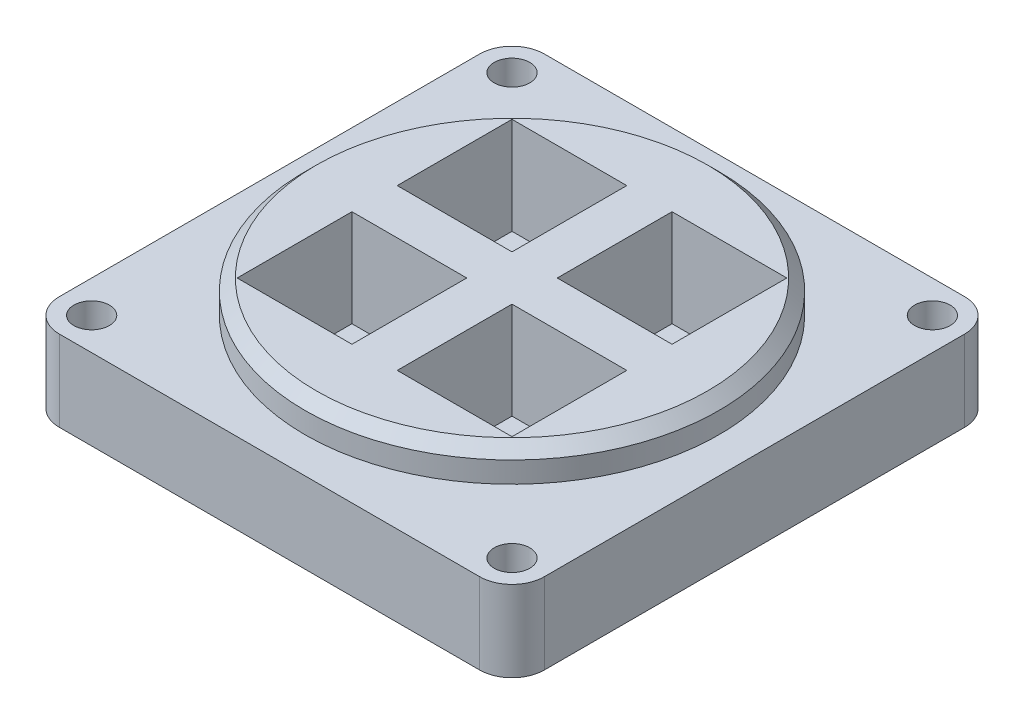
ISO-10303-21;
HEADER;
FILE_DESCRIPTION(('STEP AP214'),'2;1');
FILE_NAME('part.step','',(''),(''),'','','');
FILE_SCHEMA(('AUTOMOTIVE_DESIGN { 1 0 10303 214 1 1 1 1 }'));
ENDSEC;
DATA;
#1=APPLICATION_CONTEXT('core data for automotive mechanical design processes');
#2=APPLICATION_PROTOCOL_DEFINITION('international standard','automotive_design',2000,#1);
#3=PRODUCT_CONTEXT('',#1,'mechanical');
#4=PRODUCT('Part','Part','',(#3));
#5=PRODUCT_RELATED_PRODUCT_CATEGORY('part','',(#4));
#6=PRODUCT_DEFINITION_FORMATION('','',#4);
#7=PRODUCT_DEFINITION_CONTEXT('part definition',#1,'design');
#8=PRODUCT_DEFINITION('design','',#6,#7);
#9=PRODUCT_DEFINITION_SHAPE('','',#8);
#10=(LENGTH_UNIT() NAMED_UNIT(*) SI_UNIT(.MILLI.,.METRE.));
#11=(NAMED_UNIT(*) PLANE_ANGLE_UNIT() SI_UNIT($,.RADIAN.));
#12=(NAMED_UNIT(*) SI_UNIT($,.STERADIAN.) SOLID_ANGLE_UNIT());
#13=UNCERTAINTY_MEASURE_WITH_UNIT(LENGTH_MEASURE(1.E-05),#10,'distance_accuracy_value','');
#14=(GEOMETRIC_REPRESENTATION_CONTEXT(3) GLOBAL_UNCERTAINTY_ASSIGNED_CONTEXT((#13)) GLOBAL_UNIT_ASSIGNED_CONTEXT((#10,
#11,#12)) REPRESENTATION_CONTEXT('',''));
#15=CARTESIAN_POINT('',(0.,0.,0.));
#16=DIRECTION('',(0.,0.,1.));
#17=DIRECTION('',(1.,0.,0.));
#18=AXIS2_PLACEMENT_3D('',#15,#16,#17);
#19=CARTESIAN_POINT('',(0.,17.78,0.));
#20=DIRECTION('',(0.,1.,0.));
#21=DIRECTION('',(0.,0.,1.));
#22=AXIS2_PLACEMENT_3D('',#19,#20,#21);
#23=PLANE('',#22);
#24=CARTESIAN_POINT('',(0.,17.78,0.));
#25=DIRECTION('',(0.,1.,0.));
#26=DIRECTION('',(0.,0.,1.));
#27=AXIS2_PLACEMENT_3D('',#24,#25,#26);
#28=CIRCLE('',#27,30.734);
#29=CARTESIAN_POINT('',(0.,17.78,30.734));
#30=VERTEX_POINT('',#29);
#31=EDGE_CURVE('E50',#30,#30,#28,.T.);
#32=ORIENTED_EDGE('',*,*,#31,.T.);
#33=EDGE_LOOP('',(#32));
#34=FACE_BOUND('',#33,.T.);
#35=DIRECTION('',(-1.,0.,0.));
#36=VECTOR('',#35,1.);
#37=CARTESIAN_POINT('',(-3.5553585694968,17.78,21.5893585694968));
#38=LINE('',#37,#36);
#39=CARTESIAN_POINT('',(-3.5553585694968,17.78,21.5893585694968));
#40=VERTEX_POINT('',#39);
#41=CARTESIAN_POINT('',(-21.5893585694968,17.78,21.5893585694968));
#42=VERTEX_POINT('',#41);
#43=EDGE_CURVE('E311',#40,#42,#38,.T.);
#44=ORIENTED_EDGE('',*,*,#43,.T.);
#45=DIRECTION('',(0.,0.,-1.));
#46=VECTOR('',#45,1.);
#47=CARTESIAN_POINT('',(-21.5893585694968,17.78,21.5893585694968));
#48=LINE('',#47,#46);
#49=CARTESIAN_POINT('',(-21.5893585694968,17.78,3.55535856949682));
#50=VERTEX_POINT('',#49);
#51=EDGE_CURVE('E236',#42,#50,#48,.T.);
#52=ORIENTED_EDGE('',*,*,#51,.T.);
#53=DIRECTION('',(1.,0.,0.));
#54=VECTOR('',#53,1.);
#55=CARTESIAN_POINT('',(-21.5893585694968,17.78,3.55535856949682));
#56=LINE('',#55,#54);
#57=CARTESIAN_POINT('',(-3.5553585694968,17.78,3.55535856949682));
#58=VERTEX_POINT('',#57);
#59=EDGE_CURVE('E320',#50,#58,#56,.T.);
#60=ORIENTED_EDGE('',*,*,#59,.T.);
#61=DIRECTION('',(0.,0.,1.));
#62=VECTOR('',#61,1.);
#63=CARTESIAN_POINT('',(-3.5553585694968,17.78,3.55535856949682));
#64=LINE('',#63,#62);
#65=EDGE_CURVE('E323',#58,#40,#64,.T.);
#66=ORIENTED_EDGE('',*,*,#65,.T.);
#67=EDGE_LOOP('',(#44,#52,#60,#66));
#68=FACE_BOUND('',#67,.T.);
#69=DIRECTION('',(-1.,0.,0.));
#70=VECTOR('',#69,1.);
#71=CARTESIAN_POINT('',(-3.55535856949682,17.78,-3.5553585694968));
#72=LINE('',#71,#70);
#73=CARTESIAN_POINT('',(-3.55535856949682,17.78,-3.5553585694968));
#74=VERTEX_POINT('',#73);
#75=CARTESIAN_POINT('',(-21.5893585694968,17.78,-3.5553585694968));
#76=VERTEX_POINT('',#75);
#77=EDGE_CURVE('E221',#74,#76,#72,.T.);
#78=ORIENTED_EDGE('',*,*,#77,.T.);
#79=DIRECTION('',(0.,0.,-1.));
#80=VECTOR('',#79,1.);
#81=CARTESIAN_POINT('',(-21.5893585694968,17.78,-3.5553585694968));
#82=LINE('',#81,#80);
#83=CARTESIAN_POINT('',(-21.5893585694968,17.78,-21.5893585694968));
#84=VERTEX_POINT('',#83);
#85=EDGE_CURVE('E231',#76,#84,#82,.T.);
#86=ORIENTED_EDGE('',*,*,#85,.T.);
#87=DIRECTION('',(1.,0.,0.));
#88=VECTOR('',#87,1.);
#89=CARTESIAN_POINT('',(-21.5893585694968,17.78,-21.5893585694968));
#90=LINE('',#89,#88);
#91=CARTESIAN_POINT('',(-3.55535856949682,17.78,-21.5893585694968));
#92=VERTEX_POINT('',#91);
#93=EDGE_CURVE('E229',#84,#92,#90,.T.);
#94=ORIENTED_EDGE('',*,*,#93,.T.);
#95=DIRECTION('',(0.,0.,1.));
#96=VECTOR('',#95,1.);
#97=CARTESIAN_POINT('',(-3.55535856949682,17.78,-21.5893585694968));
#98=LINE('',#97,#96);
#99=EDGE_CURVE('E210',#92,#74,#98,.T.);
#100=ORIENTED_EDGE('',*,*,#99,.T.);
#101=EDGE_LOOP('',(#78,#86,#94,#100));
#102=FACE_BOUND('',#101,.T.);
#103=DIRECTION('',(1.,0.,0.));
#104=VECTOR('',#103,1.);
#105=CARTESIAN_POINT('',(3.5553585694968,17.78,-21.5893585694968));
#106=LINE('',#105,#104);
#107=CARTESIAN_POINT('',(3.5553585694968,17.78,-21.5893585694968));
#108=VERTEX_POINT('',#107);
#109=CARTESIAN_POINT('',(21.5893585694968,17.78,-21.5893585694968));
#110=VERTEX_POINT('',#109);
#111=EDGE_CURVE('E256',#108,#110,#106,.T.);
#112=ORIENTED_EDGE('',*,*,#111,.T.);
#113=DIRECTION('',(0.,0.,1.));
#114=VECTOR('',#113,1.);
#115=CARTESIAN_POINT('',(21.5893585694968,17.78,-21.5893585694968));
#116=LINE('',#115,#114);
#117=CARTESIAN_POINT('',(21.5893585694968,17.78,-3.55535856949682));
#118=VERTEX_POINT('',#117);
#119=EDGE_CURVE('E266',#110,#118,#116,.T.);
#120=ORIENTED_EDGE('',*,*,#119,.T.);
#121=DIRECTION('',(-1.,0.,0.));
#122=VECTOR('',#121,1.);
#123=CARTESIAN_POINT('',(21.5893585694968,17.78,-3.55535856949682));
#124=LINE('',#123,#122);
#125=CARTESIAN_POINT('',(3.5553585694968,17.78,-3.55535856949682));
#126=VERTEX_POINT('',#125);
#127=EDGE_CURVE('E263',#118,#126,#124,.T.);
#128=ORIENTED_EDGE('',*,*,#127,.T.);
#129=DIRECTION('',(0.,0.,-1.));
#130=VECTOR('',#129,1.);
#131=CARTESIAN_POINT('',(3.5553585694968,17.78,-3.55535856949682));
#132=LINE('',#131,#130);
#133=EDGE_CURVE('E259',#126,#108,#132,.T.);
#134=ORIENTED_EDGE('',*,*,#133,.T.);
#135=EDGE_LOOP('',(#112,#120,#128,#134));
#136=FACE_BOUND('',#135,.T.);
#137=DIRECTION('',(0.,0.,1.));
#138=VECTOR('',#137,1.);
#139=CARTESIAN_POINT('',(21.5893585694968,17.78,3.5553585694968));
#140=LINE('',#139,#138);
#141=CARTESIAN_POINT('',(21.5893585694968,17.78,3.5553585694968));
#142=VERTEX_POINT('',#141);
#143=CARTESIAN_POINT('',(21.5893585694968,17.78,21.5893585694968));
#144=VERTEX_POINT('',#143);
#145=EDGE_CURVE('E288',#142,#144,#140,.T.);
#146=ORIENTED_EDGE('',*,*,#145,.T.);
#147=DIRECTION('',(-1.,0.,0.));
#148=VECTOR('',#147,1.);
#149=CARTESIAN_POINT('',(21.5893585694968,17.78,21.5893585694968));
#150=LINE('',#149,#148);
#151=CARTESIAN_POINT('',(3.55535856949682,17.78,21.5893585694968));
#152=VERTEX_POINT('',#151);
#153=EDGE_CURVE('E248',#144,#152,#150,.T.);
#154=ORIENTED_EDGE('',*,*,#153,.T.);
#155=DIRECTION('',(0.,0.,-1.));
#156=VECTOR('',#155,1.);
#157=CARTESIAN_POINT('',(3.55535856949682,17.78,21.5893585694968));
#158=LINE('',#157,#156);
#159=CARTESIAN_POINT('',(3.55535856949682,17.78,3.5553585694968));
#160=VERTEX_POINT('',#159);
#161=EDGE_CURVE('E295',#152,#160,#158,.T.);
#162=ORIENTED_EDGE('',*,*,#161,.T.);
#163=DIRECTION('',(1.,0.,0.));
#164=VECTOR('',#163,1.);
#165=CARTESIAN_POINT('',(3.55535856949682,17.78,3.5553585694968));
#166=LINE('',#165,#164);
#167=EDGE_CURVE('E291',#160,#142,#166,.T.);
#168=ORIENTED_EDGE('',*,*,#167,.T.);
#169=EDGE_LOOP('',(#146,#154,#162,#168));
#170=FACE_BOUND('',#169,.T.);
#171=ADVANCED_FACE('F41',(#34,#68,#102,#136,#170),#23,.T.);
#172=CARTESIAN_POINT('',(38.1,12.7,38.1));
#173=DIRECTION('',(-1.,0.,0.));
#174=DIRECTION('',(0.,0.,1.));
#175=AXIS2_PLACEMENT_3D('',#172,#173,#174);
#176=PLANE('',#175);
#177=DIRECTION('',(0.,0.,-1.));
#178=VECTOR('',#177,1.);
#179=CARTESIAN_POINT('',(38.1,12.7,38.1));
#180=LINE('',#179,#178);
#181=CARTESIAN_POINT('',(38.1,12.7,33.02));
#182=VERTEX_POINT('',#181);
#183=CARTESIAN_POINT('',(38.1,12.7,-33.02));
#184=VERTEX_POINT('',#183);
#185=EDGE_CURVE('E362',#182,#184,#180,.T.);
#186=ORIENTED_EDGE('',*,*,#185,.F.);
#187=DIRECTION('',(0.,-1.,0.));
#188=VECTOR('',#187,1.);
#189=CARTESIAN_POINT('',(38.1,12.7,33.02));
#190=LINE('',#189,#188);
#191=CARTESIAN_POINT('',(38.1,0.,33.02));
#192=VERTEX_POINT('',#191);
#193=EDGE_CURVE('E412',#182,#192,#190,.T.);
#194=ORIENTED_EDGE('',*,*,#193,.T.);
#195=DIRECTION('',(0.,0.,-1.));
#196=VECTOR('',#195,1.);
#197=CARTESIAN_POINT('',(38.1,0.,38.1));
#198=LINE('',#197,#196);
#199=CARTESIAN_POINT('',(38.1,0.,-33.02));
#200=VERTEX_POINT('',#199);
#201=EDGE_CURVE('E359',#192,#200,#198,.T.);
#202=ORIENTED_EDGE('',*,*,#201,.T.);
#203=DIRECTION('',(0.,-1.,0.));
#204=VECTOR('',#203,1.);
#205=CARTESIAN_POINT('',(38.1,12.7,-33.02));
#206=LINE('',#205,#204);
#207=EDGE_CURVE('E410',#200,#184,#206,.F.);
#208=ORIENTED_EDGE('',*,*,#207,.T.);
#209=EDGE_LOOP('',(#186,#194,#202,#208));
#210=FACE_BOUND('',#209,.T.);
#211=ADVANCED_FACE('F433',(#210),#176,.F.);
#212=CARTESIAN_POINT('',(-38.1,12.7,-38.1));
#213=DIRECTION('',(0.,0.,1.));
#214=DIRECTION('',(1.,0.,0.));
#215=AXIS2_PLACEMENT_3D('',#212,#213,#214);
#216=PLANE('',#215);
#217=DIRECTION('',(-1.,0.,0.));
#218=VECTOR('',#217,1.);
#219=CARTESIAN_POINT('',(-38.1,12.7,-38.1));
#220=LINE('',#219,#218);
#221=CARTESIAN_POINT('',(33.02,12.7,-38.1));
#222=VERTEX_POINT('',#221);
#223=CARTESIAN_POINT('',(-33.02,12.7,-38.1));
#224=VERTEX_POINT('',#223);
#225=EDGE_CURVE('E364',#222,#224,#220,.T.);
#226=ORIENTED_EDGE('',*,*,#225,.F.);
#227=DIRECTION('',(0.,-1.,0.));
#228=VECTOR('',#227,1.);
#229=CARTESIAN_POINT('',(33.02,12.7,-38.1));
#230=LINE('',#229,#228);
#231=CARTESIAN_POINT('',(33.02,0.,-38.1));
#232=VERTEX_POINT('',#231);
#233=EDGE_CURVE('E416',#222,#232,#230,.T.);
#234=ORIENTED_EDGE('',*,*,#233,.T.);
#235=DIRECTION('',(-1.,0.,0.));
#236=VECTOR('',#235,1.);
#237=CARTESIAN_POINT('',(-38.1,0.,-38.1));
#238=LINE('',#237,#236);
#239=CARTESIAN_POINT('',(-33.02,0.,-38.1));
#240=VERTEX_POINT('',#239);
#241=EDGE_CURVE('E376',#232,#240,#238,.T.);
#242=ORIENTED_EDGE('',*,*,#241,.T.);
#243=DIRECTION('',(0.,-1.,0.));
#244=VECTOR('',#243,1.);
#245=CARTESIAN_POINT('',(-33.02,12.7,-38.1));
#246=LINE('',#245,#244);
#247=EDGE_CURVE('E57',#240,#224,#246,.F.);
#248=ORIENTED_EDGE('',*,*,#247,.T.);
#249=EDGE_LOOP('',(#226,#234,#242,#248));
#250=FACE_BOUND('',#249,.T.);
#251=ADVANCED_FACE('F438',(#250),#216,.F.);
#252=CARTESIAN_POINT('',(-38.1,12.7,38.1));
#253=DIRECTION('',(1.,0.,0.));
#254=DIRECTION('',(0.,0.,-1.));
#255=AXIS2_PLACEMENT_3D('',#252,#253,#254);
#256=PLANE('',#255);
#257=DIRECTION('',(0.,0.,1.));
#258=VECTOR('',#257,1.);
#259=CARTESIAN_POINT('',(-38.1,0.,38.1));
#260=LINE('',#259,#258);
#261=CARTESIAN_POINT('',(-38.1,0.,-33.02));
#262=VERTEX_POINT('',#261);
#263=CARTESIAN_POINT('',(-38.1,0.,33.02));
#264=VERTEX_POINT('',#263);
#265=EDGE_CURVE('E378',#262,#264,#260,.T.);
#266=ORIENTED_EDGE('',*,*,#265,.T.);
#267=DIRECTION('',(0.,-1.,0.));
#268=VECTOR('',#267,1.);
#269=CARTESIAN_POINT('',(-38.1,12.7,33.02));
#270=LINE('',#269,#268);
#271=CARTESIAN_POINT('',(-38.1,12.7,33.02));
#272=VERTEX_POINT('',#271);
#273=EDGE_CURVE('E401',#264,#272,#270,.F.);
#274=ORIENTED_EDGE('',*,*,#273,.T.);
#275=DIRECTION('',(0.,0.,1.));
#276=VECTOR('',#275,1.);
#277=CARTESIAN_POINT('',(-38.1,12.7,38.1));
#278=LINE('',#277,#276);
#279=CARTESIAN_POINT('',(-38.1,12.7,-33.02));
#280=VERTEX_POINT('',#279);
#281=EDGE_CURVE('E367',#280,#272,#278,.T.);
#282=ORIENTED_EDGE('',*,*,#281,.F.);
#283=DIRECTION('',(0.,-1.,0.));
#284=VECTOR('',#283,1.);
#285=CARTESIAN_POINT('',(-38.1,12.7,-33.02));
#286=LINE('',#285,#284);
#287=EDGE_CURVE('E398',#280,#262,#286,.T.);
#288=ORIENTED_EDGE('',*,*,#287,.T.);
#289=EDGE_LOOP('',(#266,#274,#282,#288));
#290=FACE_BOUND('',#289,.T.);
#291=ADVANCED_FACE('F476',(#290),#256,.F.);
#292=CARTESIAN_POINT('',(-38.1,12.7,38.1));
#293=DIRECTION('',(0.,0.,-1.));
#294=DIRECTION('',(-1.,0.,0.));
#295=AXIS2_PLACEMENT_3D('',#292,#293,#294);
#296=PLANE('',#295);
#297=DIRECTION('',(1.,0.,0.));
#298=VECTOR('',#297,1.);
#299=CARTESIAN_POINT('',(-38.1,12.7,38.1));
#300=LINE('',#299,#298);
#301=CARTESIAN_POINT('',(-33.02,12.7,38.1));
#302=VERTEX_POINT('',#301);
#303=CARTESIAN_POINT('',(33.02,12.7,38.1));
#304=VERTEX_POINT('',#303);
#305=EDGE_CURVE('E370',#302,#304,#300,.T.);
#306=ORIENTED_EDGE('',*,*,#305,.F.);
#307=DIRECTION('',(0.,-1.,0.));
#308=VECTOR('',#307,1.);
#309=CARTESIAN_POINT('',(-33.02,12.7,38.1));
#310=LINE('',#309,#308);
#311=CARTESIAN_POINT('',(-33.02,0.,38.1));
#312=VERTEX_POINT('',#311);
#313=EDGE_CURVE('E387',#302,#312,#310,.T.);
#314=ORIENTED_EDGE('',*,*,#313,.T.);
#315=DIRECTION('',(1.,0.,0.));
#316=VECTOR('',#315,1.);
#317=CARTESIAN_POINT('',(-38.1,0.,38.1));
#318=LINE('',#317,#316);
#319=CARTESIAN_POINT('',(33.02,0.,38.1));
#320=VERTEX_POINT('',#319);
#321=EDGE_CURVE('E365',#312,#320,#318,.T.);
#322=ORIENTED_EDGE('',*,*,#321,.T.);
#323=DIRECTION('',(0.,-1.,0.));
#324=VECTOR('',#323,1.);
#325=CARTESIAN_POINT('',(33.02,12.7,38.1));
#326=LINE('',#325,#324);
#327=EDGE_CURVE('E385',#320,#304,#326,.F.);
#328=ORIENTED_EDGE('',*,*,#327,.T.);
#329=EDGE_LOOP('',(#306,#314,#322,#328));
#330=FACE_BOUND('',#329,.T.);
#331=ADVANCED_FACE('F469',(#330),#296,.F.);
#332=CARTESIAN_POINT('',(0.,12.7,0.));
#333=DIRECTION('',(0.,-1.,0.));
#334=DIRECTION('',(0.,0.,-1.));
#335=AXIS2_PLACEMENT_3D('',#332,#333,#334);
#336=PLANE('',#335);
#337=CARTESIAN_POINT('',(0.,12.7,0.));
#338=DIRECTION('',(0.,-1.,0.));
#339=DIRECTION('',(0.,0.,-1.));
#340=AXIS2_PLACEMENT_3D('',#337,#338,#339);
#341=CIRCLE('',#340,32.512);
#342=CARTESIAN_POINT('',(0.,12.7,-32.512));
#343=VERTEX_POINT('',#342);
#344=EDGE_CURVE('E373',#343,#343,#341,.F.);
#345=ORIENTED_EDGE('',*,*,#344,.F.);
#346=EDGE_LOOP('',(#345));
#347=FACE_BOUND('',#346,.T.);
#348=CARTESIAN_POINT('',(33.02,12.7,-33.02));
#349=DIRECTION('',(0.,1.,0.));
#350=DIRECTION('',(0.,0.,1.));
#351=AXIS2_PLACEMENT_3D('',#348,#349,#350);
#352=CIRCLE('',#351,2.794);
#353=CARTESIAN_POINT('',(33.02,12.7,-30.226));
#354=VERTEX_POINT('',#353);
#355=EDGE_CURVE('E344',#354,#354,#352,.T.);
#356=ORIENTED_EDGE('',*,*,#355,.F.);
#357=EDGE_LOOP('',(#356));
#358=FACE_BOUND('',#357,.T.);
#359=CARTESIAN_POINT('',(-33.02,12.7,33.02));
#360=DIRECTION('',(0.,1.,0.));
#361=DIRECTION('',(0.,0.,1.));
#362=AXIS2_PLACEMENT_3D('',#359,#360,#361);
#363=CIRCLE('',#362,2.794);
#364=CARTESIAN_POINT('',(-33.02,12.7,35.814));
#365=VERTEX_POINT('',#364);
#366=EDGE_CURVE('E351',#365,#365,#363,.T.);
#367=ORIENTED_EDGE('',*,*,#366,.F.);
#368=EDGE_LOOP('',(#367));
#369=FACE_BOUND('',#368,.T.);
#370=CARTESIAN_POINT('',(-33.02,12.7,-33.02));
#371=DIRECTION('',(0.,1.,0.));
#372=DIRECTION('',(0.,0.,1.));
#373=AXIS2_PLACEMENT_3D('',#370,#371,#372);
#374=CIRCLE('',#373,2.794);
#375=CARTESIAN_POINT('',(-33.02,12.7,-30.226));
#376=VERTEX_POINT('',#375);
#377=EDGE_CURVE('E338',#376,#376,#374,.T.);
#378=ORIENTED_EDGE('',*,*,#377,.F.);
#379=EDGE_LOOP('',(#378));
#380=FACE_BOUND('',#379,.T.);
#381=CARTESIAN_POINT('',(33.02,12.7,33.02));
#382=DIRECTION('',(0.,1.,0.));
#383=DIRECTION('',(0.,0.,1.));
#384=AXIS2_PLACEMENT_3D('',#381,#382,#383);
#385=CIRCLE('',#384,2.794);
#386=CARTESIAN_POINT('',(33.02,12.7,35.814));
#387=VERTEX_POINT('',#386);
#388=EDGE_CURVE('E347',#387,#387,#385,.T.);
#389=ORIENTED_EDGE('',*,*,#388,.F.);
#390=EDGE_LOOP('',(#389));
#391=FACE_BOUND('',#390,.T.);
#392=ORIENTED_EDGE('',*,*,#281,.T.);
#393=CARTESIAN_POINT('',(-33.02,12.7,33.02));
#394=DIRECTION('',(0.,-1.,0.));
#395=DIRECTION('',(0.,0.,-1.));
#396=AXIS2_PLACEMENT_3D('',#393,#394,#395);
#397=CIRCLE('',#396,5.08);
#398=EDGE_CURVE('E408',#272,#302,#397,.F.);
#399=ORIENTED_EDGE('',*,*,#398,.T.);
#400=ORIENTED_EDGE('',*,*,#305,.T.);
#401=CARTESIAN_POINT('',(33.02,12.7,33.02));
#402=DIRECTION('',(0.,-1.,0.));
#403=DIRECTION('',(0.,0.,-1.));
#404=AXIS2_PLACEMENT_3D('',#401,#402,#403);
#405=CIRCLE('',#404,5.08);
#406=EDGE_CURVE('E406',#304,#182,#405,.F.);
#407=ORIENTED_EDGE('',*,*,#406,.T.);
#408=ORIENTED_EDGE('',*,*,#185,.T.);
#409=CARTESIAN_POINT('',(33.02,12.7,-33.02));
#410=DIRECTION('',(0.,-1.,0.));
#411=DIRECTION('',(0.,0.,-1.));
#412=AXIS2_PLACEMENT_3D('',#409,#410,#411);
#413=CIRCLE('',#412,5.08);
#414=EDGE_CURVE('E64',#184,#222,#413,.F.);
#415=ORIENTED_EDGE('',*,*,#414,.T.);
#416=ORIENTED_EDGE('',*,*,#225,.T.);
#417=CARTESIAN_POINT('',(-33.02,12.7,-33.02));
#418=DIRECTION('',(0.,-1.,0.));
#419=DIRECTION('',(0.,0.,-1.));
#420=AXIS2_PLACEMENT_3D('',#417,#418,#419);
#421=CIRCLE('',#420,5.08);
#422=EDGE_CURVE('E403',#224,#280,#421,.F.);
#423=ORIENTED_EDGE('',*,*,#422,.T.);
#424=EDGE_LOOP('',(#392,#399,#400,#407,#408,#415,#416,#423));
#425=FACE_BOUND('',#424,.T.);
#426=ADVANCED_FACE('F466',(#347,#358,#369,#380,#391,#425),#336,.F.);
#427=CARTESIAN_POINT('',(0.,0.,0.));
#428=DIRECTION('',(0.,-1.,0.));
#429=DIRECTION('',(0.,0.,-1.));
#430=AXIS2_PLACEMENT_3D('',#427,#428,#429);
#431=PLANE('',#430);
#432=CARTESIAN_POINT('',(33.02,0.,-33.02));
#433=DIRECTION('',(0.,1.,0.));
#434=DIRECTION('',(0.,0.,1.));
#435=AXIS2_PLACEMENT_3D('',#432,#433,#434);
#436=CIRCLE('',#435,2.794);
#437=CARTESIAN_POINT('',(33.02,0.,-30.226));
#438=VERTEX_POINT('',#437);
#439=EDGE_CURVE('E348',#438,#438,#436,.T.);
#440=ORIENTED_EDGE('',*,*,#439,.T.);
#441=EDGE_LOOP('',(#440));
#442=FACE_BOUND('',#441,.T.);
#443=CARTESIAN_POINT('',(-33.02,0.,33.02));
#444=DIRECTION('',(0.,1.,0.));
#445=DIRECTION('',(0.,0.,1.));
#446=AXIS2_PLACEMENT_3D('',#443,#444,#445);
#447=CIRCLE('',#446,2.794);
#448=CARTESIAN_POINT('',(-33.02,0.,35.814));
#449=VERTEX_POINT('',#448);
#450=EDGE_CURVE('E341',#449,#449,#447,.T.);
#451=ORIENTED_EDGE('',*,*,#450,.T.);
#452=EDGE_LOOP('',(#451));
#453=FACE_BOUND('',#452,.T.);
#454=CARTESIAN_POINT('',(-33.02,0.,-33.02));
#455=DIRECTION('',(0.,1.,0.));
#456=DIRECTION('',(0.,0.,1.));
#457=AXIS2_PLACEMENT_3D('',#454,#455,#456);
#458=CIRCLE('',#457,2.794);
#459=CARTESIAN_POINT('',(-33.02,0.,-30.226));
#460=VERTEX_POINT('',#459);
#461=EDGE_CURVE('E337',#460,#460,#458,.T.);
#462=ORIENTED_EDGE('',*,*,#461,.T.);
#463=EDGE_LOOP('',(#462));
#464=FACE_BOUND('',#463,.T.);
#465=CARTESIAN_POINT('',(33.02,0.,33.02));
#466=DIRECTION('',(0.,1.,0.));
#467=DIRECTION('',(0.,0.,1.));
#468=AXIS2_PLACEMENT_3D('',#465,#466,#467);
#469=CIRCLE('',#468,2.794);
#470=CARTESIAN_POINT('',(33.02,0.,35.814));
#471=VERTEX_POINT('',#470);
#472=EDGE_CURVE('E356',#471,#471,#469,.T.);
#473=ORIENTED_EDGE('',*,*,#472,.T.);
#474=EDGE_LOOP('',(#473));
#475=FACE_BOUND('',#474,.T.);
#476=ORIENTED_EDGE('',*,*,#321,.F.);
#477=CARTESIAN_POINT('',(-33.02,0.,33.02));
#478=DIRECTION('',(0.,-1.,0.));
#479=DIRECTION('',(0.,0.,-1.));
#480=AXIS2_PLACEMENT_3D('',#477,#478,#479);
#481=CIRCLE('',#480,5.08);
#482=EDGE_CURVE('E396',#312,#264,#481,.T.);
#483=ORIENTED_EDGE('',*,*,#482,.T.);
#484=ORIENTED_EDGE('',*,*,#265,.F.);
#485=CARTESIAN_POINT('',(-33.02,0.,-33.02));
#486=DIRECTION('',(0.,-1.,0.));
#487=DIRECTION('',(0.,0.,-1.));
#488=AXIS2_PLACEMENT_3D('',#485,#486,#487);
#489=CIRCLE('',#488,5.08);
#490=EDGE_CURVE('E390',#262,#240,#489,.T.);
#491=ORIENTED_EDGE('',*,*,#490,.T.);
#492=ORIENTED_EDGE('',*,*,#241,.F.);
#493=CARTESIAN_POINT('',(33.02,0.,-33.02));
#494=DIRECTION('',(0.,-1.,0.));
#495=DIRECTION('',(0.,0.,-1.));
#496=AXIS2_PLACEMENT_3D('',#493,#494,#495);
#497=CIRCLE('',#496,5.08);
#498=EDGE_CURVE('E392',#232,#200,#497,.T.);
#499=ORIENTED_EDGE('',*,*,#498,.T.);
#500=ORIENTED_EDGE('',*,*,#201,.F.);
#501=CARTESIAN_POINT('',(33.02,0.,33.02));
#502=DIRECTION('',(0.,-1.,0.));
#503=DIRECTION('',(0.,0.,-1.));
#504=AXIS2_PLACEMENT_3D('',#501,#502,#503);
#505=CIRCLE('',#504,5.08);
#506=EDGE_CURVE('E394',#192,#320,#505,.T.);
#507=ORIENTED_EDGE('',*,*,#506,.T.);
#508=EDGE_LOOP('',(#476,#483,#484,#491,#492,#499,#500,#507));
#509=FACE_BOUND('',#508,.T.);
#510=ADVANCED_FACE('F464',(#442,#453,#464,#475,#509),#431,.T.);
#511=CARTESIAN_POINT('',(33.02,0.,33.02));
#512=DIRECTION('',(0.,1.,0.));
#513=DIRECTION('',(0.,0.,1.));
#514=AXIS2_PLACEMENT_3D('',#511,#512,#513);
#515=CYLINDRICAL_SURFACE('',#514,2.794);
#516=ORIENTED_EDGE('',*,*,#472,.F.);
#517=EDGE_LOOP('',(#516));
#518=FACE_BOUND('',#517,.T.);
#519=ORIENTED_EDGE('',*,*,#388,.T.);
#520=EDGE_LOOP('',(#519));
#521=FACE_BOUND('',#520,.T.);
#522=ADVANCED_FACE('F454',(#518,#521),#515,.F.);
#523=CARTESIAN_POINT('',(-33.02,0.,-33.02));
#524=DIRECTION('',(0.,1.,0.));
#525=DIRECTION('',(0.,0.,1.));
#526=AXIS2_PLACEMENT_3D('',#523,#524,#525);
#527=CYLINDRICAL_SURFACE('',#526,2.794);
#528=ORIENTED_EDGE('',*,*,#461,.F.);
#529=EDGE_LOOP('',(#528));
#530=FACE_BOUND('',#529,.T.);
#531=ORIENTED_EDGE('',*,*,#377,.T.);
#532=EDGE_LOOP('',(#531));
#533=FACE_BOUND('',#532,.T.);
#534=ADVANCED_FACE('F450',(#530,#533),#527,.F.);
#535=CARTESIAN_POINT('',(-33.02,0.,33.02));
#536=DIRECTION('',(0.,1.,0.));
#537=DIRECTION('',(0.,0.,1.));
#538=AXIS2_PLACEMENT_3D('',#535,#536,#537);
#539=CYLINDRICAL_SURFACE('',#538,2.794);
#540=ORIENTED_EDGE('',*,*,#450,.F.);
#541=EDGE_LOOP('',(#540));
#542=FACE_BOUND('',#541,.T.);
#543=ORIENTED_EDGE('',*,*,#366,.T.);
#544=EDGE_LOOP('',(#543));
#545=FACE_BOUND('',#544,.T.);
#546=ADVANCED_FACE('F453',(#542,#545),#539,.F.);
#547=CARTESIAN_POINT('',(33.02,0.,-33.02));
#548=DIRECTION('',(0.,1.,0.));
#549=DIRECTION('',(0.,0.,1.));
#550=AXIS2_PLACEMENT_3D('',#547,#548,#549);
#551=CYLINDRICAL_SURFACE('',#550,2.794);
#552=ORIENTED_EDGE('',*,*,#439,.F.);
#553=EDGE_LOOP('',(#552));
#554=FACE_BOUND('',#553,.T.);
#555=ORIENTED_EDGE('',*,*,#355,.T.);
#556=EDGE_LOOP('',(#555));
#557=FACE_BOUND('',#556,.T.);
#558=ADVANCED_FACE('F448',(#554,#557),#551,.F.);
#559=CARTESIAN_POINT('',(0.,17.78,0.));
#560=DIRECTION('',(0.,-1.,0.));
#561=DIRECTION('',(0.,0.,-1.));
#562=AXIS2_PLACEMENT_3D('',#559,#560,#561);
#563=CYLINDRICAL_SURFACE('',#562,32.512);
#564=CARTESIAN_POINT('',(0.,16.002,0.));
#565=DIRECTION('',(0.,1.,0.));
#566=DIRECTION('',(0.,0.,1.));
#567=AXIS2_PLACEMENT_3D('',#564,#565,#566);
#568=CIRCLE('',#567,32.512);
#569=CARTESIAN_POINT('',(0.,16.002,32.512));
#570=VERTEX_POINT('',#569);
#571=EDGE_CURVE('E11',#570,#570,#568,.F.);
#572=ORIENTED_EDGE('',*,*,#571,.T.);
#573=EDGE_LOOP('',(#572));
#574=FACE_BOUND('',#573,.T.);
#575=ORIENTED_EDGE('',*,*,#344,.T.);
#576=EDGE_LOOP('',(#575));
#577=FACE_BOUND('',#576,.T.);
#578=ADVANCED_FACE('F445',(#574,#577),#563,.T.);
#579=CARTESIAN_POINT('',(-21.5893585694968,2.54,21.5893585694968));
#580=DIRECTION('',(1.,0.,0.));
#581=DIRECTION('',(0.,0.,-1.));
#582=AXIS2_PLACEMENT_3D('',#579,#580,#581);
#583=PLANE('',#582);
#584=ORIENTED_EDGE('',*,*,#51,.F.);
#585=DIRECTION('',(0.,1.,0.));
#586=VECTOR('',#585,1.);
#587=CARTESIAN_POINT('',(-21.5893585694968,2.54,21.5893585694968));
#588=LINE('',#587,#586);
#589=CARTESIAN_POINT('',(-21.5893585694968,2.54,21.5893585694968));
#590=VERTEX_POINT('',#589);
#591=EDGE_CURVE('E317',#590,#42,#588,.T.);
#592=ORIENTED_EDGE('',*,*,#591,.F.);
#593=DIRECTION('',(0.,0.,-1.));
#594=VECTOR('',#593,1.);
#595=CARTESIAN_POINT('',(-21.5893585694968,2.54,21.5893585694968));
#596=LINE('',#595,#594);
#597=CARTESIAN_POINT('',(-21.5893585694968,2.54,3.55535856949682));
#598=VERTEX_POINT('',#597);
#599=EDGE_CURVE('E307',#590,#598,#596,.T.);
#600=ORIENTED_EDGE('',*,*,#599,.T.);
#601=DIRECTION('',(0.,1.,0.));
#602=VECTOR('',#601,1.);
#603=CARTESIAN_POINT('',(-21.5893585694968,2.54,3.55535856949682));
#604=LINE('',#603,#602);
#605=EDGE_CURVE('E334',#598,#50,#604,.T.);
#606=ORIENTED_EDGE('',*,*,#605,.T.);
#607=EDGE_LOOP('',(#584,#592,#600,#606));
#608=FACE_BOUND('',#607,.T.);
#609=ADVANCED_FACE('F443',(#608),#583,.T.);
#610=CARTESIAN_POINT('',(-21.5893585694968,2.54,3.55535856949682));
#611=DIRECTION('',(0.,0.,1.));
#612=DIRECTION('',(1.,0.,0.));
#613=AXIS2_PLACEMENT_3D('',#610,#611,#612);
#614=PLANE('',#613);
#615=ORIENTED_EDGE('',*,*,#59,.F.);
#616=ORIENTED_EDGE('',*,*,#605,.F.);
#617=DIRECTION('',(1.,0.,0.));
#618=VECTOR('',#617,1.);
#619=CARTESIAN_POINT('',(-21.5893585694968,2.54,3.55535856949682));
#620=LINE('',#619,#618);
#621=CARTESIAN_POINT('',(-3.5553585694968,2.54,3.55535856949682));
#622=VERTEX_POINT('',#621);
#623=EDGE_CURVE('E310',#598,#622,#620,.T.);
#624=ORIENTED_EDGE('',*,*,#623,.T.);
#625=DIRECTION('',(0.,1.,0.));
#626=VECTOR('',#625,1.);
#627=CARTESIAN_POINT('',(-3.5553585694968,2.54,3.55535856949682));
#628=LINE('',#627,#626);
#629=EDGE_CURVE('E332',#622,#58,#628,.T.);
#630=ORIENTED_EDGE('',*,*,#629,.T.);
#631=EDGE_LOOP('',(#615,#616,#624,#630));
#632=FACE_BOUND('',#631,.T.);
#633=ADVANCED_FACE('F733',(#632),#614,.T.);
#634=CARTESIAN_POINT('',(-3.5553585694968,2.54,3.55535856949682));
#635=DIRECTION('',(-1.,0.,0.));
#636=DIRECTION('',(0.,0.,1.));
#637=AXIS2_PLACEMENT_3D('',#634,#635,#636);
#638=PLANE('',#637);
#639=ORIENTED_EDGE('',*,*,#65,.F.);
#640=ORIENTED_EDGE('',*,*,#629,.F.);
#641=DIRECTION('',(0.,0.,1.));
#642=VECTOR('',#641,1.);
#643=CARTESIAN_POINT('',(-3.5553585694968,2.54,3.55535856949682));
#644=LINE('',#643,#642);
#645=CARTESIAN_POINT('',(-3.5553585694968,2.54,21.5893585694968));
#646=VERTEX_POINT('',#645);
#647=EDGE_CURVE('E313',#622,#646,#644,.T.);
#648=ORIENTED_EDGE('',*,*,#647,.T.);
#649=DIRECTION('',(0.,1.,0.));
#650=VECTOR('',#649,1.);
#651=CARTESIAN_POINT('',(-3.5553585694968,2.54,21.5893585694968));
#652=LINE('',#651,#650);
#653=EDGE_CURVE('E330',#646,#40,#652,.T.);
#654=ORIENTED_EDGE('',*,*,#653,.T.);
#655=EDGE_LOOP('',(#639,#640,#648,#654));
#656=FACE_BOUND('',#655,.T.);
#657=ADVANCED_FACE('F723',(#656),#638,.T.);
#658=CARTESIAN_POINT('',(-3.5553585694968,2.54,21.5893585694968));
#659=DIRECTION('',(0.,0.,-1.));
#660=DIRECTION('',(-1.,0.,0.));
#661=AXIS2_PLACEMENT_3D('',#658,#659,#660);
#662=PLANE('',#661);
#663=ORIENTED_EDGE('',*,*,#43,.F.);
#664=ORIENTED_EDGE('',*,*,#653,.F.);
#665=DIRECTION('',(-1.,0.,0.));
#666=VECTOR('',#665,1.);
#667=CARTESIAN_POINT('',(-3.5553585694968,2.54,21.5893585694968));
#668=LINE('',#667,#666);
#669=EDGE_CURVE('E315',#646,#590,#668,.T.);
#670=ORIENTED_EDGE('',*,*,#669,.T.);
#671=ORIENTED_EDGE('',*,*,#591,.T.);
#672=EDGE_LOOP('',(#663,#664,#670,#671));
#673=FACE_BOUND('',#672,.T.);
#674=ADVANCED_FACE('F713',(#673),#662,.T.);
#675=CARTESIAN_POINT('',(0.,2.54,0.));
#676=DIRECTION('',(0.,-1.,0.));
#677=DIRECTION('',(0.,0.,-1.));
#678=AXIS2_PLACEMENT_3D('',#675,#676,#677);
#679=PLANE('',#678);
#680=ORIENTED_EDGE('',*,*,#599,.F.);
#681=ORIENTED_EDGE('',*,*,#669,.F.);
#682=ORIENTED_EDGE('',*,*,#647,.F.);
#683=ORIENTED_EDGE('',*,*,#623,.F.);
#684=EDGE_LOOP('',(#680,#681,#682,#683));
#685=FACE_BOUND('',#684,.T.);
#686=ADVANCED_FACE('F703',(#685),#679,.F.);
#687=CARTESIAN_POINT('',(-21.5893585694968,2.54,-3.5553585694968));
#688=DIRECTION('',(1.,0.,0.));
#689=DIRECTION('',(0.,0.,-1.));
#690=AXIS2_PLACEMENT_3D('',#687,#688,#689);
#691=PLANE('',#690);
#692=ORIENTED_EDGE('',*,*,#85,.F.);
#693=DIRECTION('',(0.,1.,0.));
#694=VECTOR('',#693,1.);
#695=CARTESIAN_POINT('',(-21.5893585694968,2.54,-3.5553585694968));
#696=LINE('',#695,#694);
#697=CARTESIAN_POINT('',(-21.5893585694968,2.54,-3.5553585694968));
#698=VERTEX_POINT('',#697);
#699=EDGE_CURVE('E216',#698,#76,#696,.T.);
#700=ORIENTED_EDGE('',*,*,#699,.F.);
#701=DIRECTION('',(0.,0.,-1.));
#702=VECTOR('',#701,1.);
#703=CARTESIAN_POINT('',(-21.5893585694968,2.54,-3.5553585694968));
#704=LINE('',#703,#702);
#705=CARTESIAN_POINT('',(-21.5893585694968,2.54,-21.5893585694968));
#706=VERTEX_POINT('',#705);
#707=EDGE_CURVE('E226',#698,#706,#704,.T.);
#708=ORIENTED_EDGE('',*,*,#707,.T.);
#709=DIRECTION('',(0.,1.,0.));
#710=VECTOR('',#709,1.);
#711=CARTESIAN_POINT('',(-21.5893585694968,2.54,-21.5893585694968));
#712=LINE('',#711,#710);
#713=EDGE_CURVE('E269',#706,#84,#712,.T.);
#714=ORIENTED_EDGE('',*,*,#713,.T.);
#715=EDGE_LOOP('',(#692,#700,#708,#714));
#716=FACE_BOUND('',#715,.T.);
#717=ADVANCED_FACE('F693',(#716),#691,.T.);
#718=CARTESIAN_POINT('',(-21.5893585694968,2.54,-21.5893585694968));
#719=DIRECTION('',(0.,0.,1.));
#720=DIRECTION('',(1.,0.,0.));
#721=AXIS2_PLACEMENT_3D('',#718,#719,#720);
#722=PLANE('',#721);
#723=ORIENTED_EDGE('',*,*,#93,.F.);
#724=ORIENTED_EDGE('',*,*,#713,.F.);
#725=DIRECTION('',(1.,0.,0.));
#726=VECTOR('',#725,1.);
#727=CARTESIAN_POINT('',(-21.5893585694968,2.54,-21.5893585694968));
#728=LINE('',#727,#726);
#729=CARTESIAN_POINT('',(-3.55535856949682,2.54,-21.5893585694968));
#730=VERTEX_POINT('',#729);
#731=EDGE_CURVE('E240',#706,#730,#728,.T.);
#732=ORIENTED_EDGE('',*,*,#731,.T.);
#733=DIRECTION('',(0.,1.,0.));
#734=VECTOR('',#733,1.);
#735=CARTESIAN_POINT('',(-3.55535856949682,2.54,-21.5893585694968));
#736=LINE('',#735,#734);
#737=EDGE_CURVE('E217',#730,#92,#736,.T.);
#738=ORIENTED_EDGE('',*,*,#737,.T.);
#739=EDGE_LOOP('',(#723,#724,#732,#738));
#740=FACE_BOUND('',#739,.T.);
#741=ADVANCED_FACE('F684',(#740),#722,.T.);
#742=CARTESIAN_POINT('',(-3.55535856949682,2.54,-21.5893585694968));
#743=DIRECTION('',(-1.,0.,0.));
#744=DIRECTION('',(0.,0.,1.));
#745=AXIS2_PLACEMENT_3D('',#742,#743,#744);
#746=PLANE('',#745);
#747=ORIENTED_EDGE('',*,*,#99,.F.);
#748=ORIENTED_EDGE('',*,*,#737,.F.);
#749=DIRECTION('',(0.,0.,1.));
#750=VECTOR('',#749,1.);
#751=CARTESIAN_POINT('',(-3.55535856949682,2.54,-21.5893585694968));
#752=LINE('',#751,#750);
#753=CARTESIAN_POINT('',(-3.55535856949682,2.54,-3.5553585694968));
#754=VERTEX_POINT('',#753);
#755=EDGE_CURVE('E213',#730,#754,#752,.T.);
#756=ORIENTED_EDGE('',*,*,#755,.T.);
#757=DIRECTION('',(0.,1.,0.));
#758=VECTOR('',#757,1.);
#759=CARTESIAN_POINT('',(-3.55535856949682,2.54,-3.5553585694968));
#760=LINE('',#759,#758);
#761=EDGE_CURVE('E205',#754,#74,#760,.T.);
#762=ORIENTED_EDGE('',*,*,#761,.T.);
#763=EDGE_LOOP('',(#747,#748,#756,#762));
#764=FACE_BOUND('',#763,.T.);
#765=ADVANCED_FACE('F207',(#764),#746,.T.);
#766=CARTESIAN_POINT('',(-3.55535856949682,2.54,-3.5553585694968));
#767=DIRECTION('',(0.,0.,-1.));
#768=DIRECTION('',(-1.,0.,0.));
#769=AXIS2_PLACEMENT_3D('',#766,#767,#768);
#770=PLANE('',#769);
#771=ORIENTED_EDGE('',*,*,#77,.F.);
#772=ORIENTED_EDGE('',*,*,#761,.F.);
#773=DIRECTION('',(-1.,0.,0.));
#774=VECTOR('',#773,1.);
#775=CARTESIAN_POINT('',(-3.55535856949682,2.54,-3.5553585694968));
#776=LINE('',#775,#774);
#777=EDGE_CURVE('E237',#754,#698,#776,.T.);
#778=ORIENTED_EDGE('',*,*,#777,.T.);
#779=ORIENTED_EDGE('',*,*,#699,.T.);
#780=EDGE_LOOP('',(#771,#772,#778,#779));
#781=FACE_BOUND('',#780,.T.);
#782=ADVANCED_FACE('F222',(#781),#770,.T.);
#783=CARTESIAN_POINT('',(0.,2.54,0.));
#784=DIRECTION('',(0.,-1.,0.));
#785=DIRECTION('',(0.,0.,-1.));
#786=AXIS2_PLACEMENT_3D('',#783,#784,#785);
#787=PLANE('',#786);
#788=ORIENTED_EDGE('',*,*,#707,.F.);
#789=ORIENTED_EDGE('',*,*,#777,.F.);
#790=ORIENTED_EDGE('',*,*,#755,.F.);
#791=ORIENTED_EDGE('',*,*,#731,.F.);
#792=EDGE_LOOP('',(#788,#789,#790,#791));
#793=FACE_BOUND('',#792,.T.);
#794=ADVANCED_FACE('F657',(#793),#787,.F.);
#795=CARTESIAN_POINT('',(21.5893585694968,2.54,-21.5893585694968));
#796=DIRECTION('',(-1.,0.,0.));
#797=DIRECTION('',(0.,0.,1.));
#798=AXIS2_PLACEMENT_3D('',#795,#796,#797);
#799=PLANE('',#798);
#800=ORIENTED_EDGE('',*,*,#119,.F.);
#801=DIRECTION('',(0.,1.,0.));
#802=VECTOR('',#801,1.);
#803=CARTESIAN_POINT('',(21.5893585694968,2.54,-21.5893585694968));
#804=LINE('',#803,#802);
#805=CARTESIAN_POINT('',(21.5893585694968,2.54,-21.5893585694968));
#806=VERTEX_POINT('',#805);
#807=EDGE_CURVE('E252',#806,#110,#804,.T.);
#808=ORIENTED_EDGE('',*,*,#807,.F.);
#809=DIRECTION('',(0.,0.,1.));
#810=VECTOR('',#809,1.);
#811=CARTESIAN_POINT('',(21.5893585694968,2.54,-21.5893585694968));
#812=LINE('',#811,#810);
#813=CARTESIAN_POINT('',(21.5893585694968,2.54,-3.55535856949682));
#814=VERTEX_POINT('',#813);
#815=EDGE_CURVE('E260',#806,#814,#812,.T.);
#816=ORIENTED_EDGE('',*,*,#815,.T.);
#817=DIRECTION('',(0.,1.,0.));
#818=VECTOR('',#817,1.);
#819=CARTESIAN_POINT('',(21.5893585694968,2.54,-3.55535856949682));
#820=LINE('',#819,#818);
#821=EDGE_CURVE('E244',#814,#118,#820,.T.);
#822=ORIENTED_EDGE('',*,*,#821,.T.);
#823=EDGE_LOOP('',(#800,#808,#816,#822));
#824=FACE_BOUND('',#823,.T.);
#825=ADVANCED_FACE('F647',(#824),#799,.T.);
#826=CARTESIAN_POINT('',(21.5893585694968,2.54,-3.55535856949682));
#827=DIRECTION('',(0.,0.,-1.));
#828=DIRECTION('',(-1.,0.,0.));
#829=AXIS2_PLACEMENT_3D('',#826,#827,#828);
#830=PLANE('',#829);
#831=ORIENTED_EDGE('',*,*,#127,.F.);
#832=ORIENTED_EDGE('',*,*,#821,.F.);
#833=DIRECTION('',(-1.,0.,0.));
#834=VECTOR('',#833,1.);
#835=CARTESIAN_POINT('',(21.5893585694968,2.54,-3.55535856949682));
#836=LINE('',#835,#834);
#837=CARTESIAN_POINT('',(3.5553585694968,2.54,-3.55535856949682));
#838=VERTEX_POINT('',#837);
#839=EDGE_CURVE('E273',#814,#838,#836,.T.);
#840=ORIENTED_EDGE('',*,*,#839,.T.);
#841=DIRECTION('',(0.,1.,0.));
#842=VECTOR('',#841,1.);
#843=CARTESIAN_POINT('',(3.5553585694968,2.54,-3.55535856949682));
#844=LINE('',#843,#842);
#845=EDGE_CURVE('E247',#838,#126,#844,.T.);
#846=ORIENTED_EDGE('',*,*,#845,.T.);
#847=EDGE_LOOP('',(#831,#832,#840,#846));
#848=FACE_BOUND('',#847,.T.);
#849=ADVANCED_FACE('F637',(#848),#830,.T.);
#850=CARTESIAN_POINT('',(3.5553585694968,2.54,-3.55535856949682));
#851=DIRECTION('',(1.,0.,0.));
#852=DIRECTION('',(0.,0.,-1.));
#853=AXIS2_PLACEMENT_3D('',#850,#851,#852);
#854=PLANE('',#853);
#855=ORIENTED_EDGE('',*,*,#133,.F.);
#856=ORIENTED_EDGE('',*,*,#845,.F.);
#857=DIRECTION('',(0.,0.,-1.));
#858=VECTOR('',#857,1.);
#859=CARTESIAN_POINT('',(3.5553585694968,2.54,-3.55535856949682));
#860=LINE('',#859,#858);
#861=CARTESIAN_POINT('',(3.5553585694968,2.54,-21.5893585694968));
#862=VERTEX_POINT('',#861);
#863=EDGE_CURVE('E271',#838,#862,#860,.T.);
#864=ORIENTED_EDGE('',*,*,#863,.T.);
#865=DIRECTION('',(0.,1.,0.));
#866=VECTOR('',#865,1.);
#867=CARTESIAN_POINT('',(3.5553585694968,2.54,-21.5893585694968));
#868=LINE('',#867,#866);
#869=EDGE_CURVE('E250',#862,#108,#868,.T.);
#870=ORIENTED_EDGE('',*,*,#869,.T.);
#871=EDGE_LOOP('',(#855,#856,#864,#870));
#872=FACE_BOUND('',#871,.T.);
#873=ADVANCED_FACE('F627',(#872),#854,.T.);
#874=CARTESIAN_POINT('',(3.5553585694968,2.54,-21.5893585694968));
#875=DIRECTION('',(0.,0.,1.));
#876=DIRECTION('',(1.,0.,0.));
#877=AXIS2_PLACEMENT_3D('',#874,#875,#876);
#878=PLANE('',#877);
#879=ORIENTED_EDGE('',*,*,#111,.F.);
#880=ORIENTED_EDGE('',*,*,#869,.F.);
#881=DIRECTION('',(1.,0.,0.));
#882=VECTOR('',#881,1.);
#883=CARTESIAN_POINT('',(3.5553585694968,2.54,-21.5893585694968));
#884=LINE('',#883,#882);
#885=EDGE_CURVE('E255',#862,#806,#884,.T.);
#886=ORIENTED_EDGE('',*,*,#885,.T.);
#887=ORIENTED_EDGE('',*,*,#807,.T.);
#888=EDGE_LOOP('',(#879,#880,#886,#887));
#889=FACE_BOUND('',#888,.T.);
#890=ADVANCED_FACE('F617',(#889),#878,.T.);
#891=CARTESIAN_POINT('',(0.,2.54,0.));
#892=DIRECTION('',(0.,-1.,0.));
#893=DIRECTION('',(0.,0.,-1.));
#894=AXIS2_PLACEMENT_3D('',#891,#892,#893);
#895=PLANE('',#894);
#896=ORIENTED_EDGE('',*,*,#815,.F.);
#897=ORIENTED_EDGE('',*,*,#885,.F.);
#898=ORIENTED_EDGE('',*,*,#863,.F.);
#899=ORIENTED_EDGE('',*,*,#839,.F.);
#900=EDGE_LOOP('',(#896,#897,#898,#899));
#901=FACE_BOUND('',#900,.T.);
#902=ADVANCED_FACE('F607',(#901),#895,.F.);
#903=CARTESIAN_POINT('',(21.5893585694968,2.54,21.5893585694968));
#904=DIRECTION('',(0.,0.,-1.));
#905=DIRECTION('',(-1.,0.,0.));
#906=AXIS2_PLACEMENT_3D('',#903,#904,#905);
#907=PLANE('',#906);
#908=ORIENTED_EDGE('',*,*,#153,.F.);
#909=DIRECTION('',(0.,1.,0.));
#910=VECTOR('',#909,1.);
#911=CARTESIAN_POINT('',(21.5893585694968,2.54,21.5893585694968));
#912=LINE('',#911,#910);
#913=CARTESIAN_POINT('',(21.5893585694968,2.54,21.5893585694968));
#914=VERTEX_POINT('',#913);
#915=EDGE_CURVE('E284',#914,#144,#912,.T.);
#916=ORIENTED_EDGE('',*,*,#915,.F.);
#917=DIRECTION('',(-1.,0.,0.));
#918=VECTOR('',#917,1.);
#919=CARTESIAN_POINT('',(21.5893585694968,2.54,21.5893585694968));
#920=LINE('',#919,#918);
#921=CARTESIAN_POINT('',(3.55535856949682,2.54,21.5893585694968));
#922=VERTEX_POINT('',#921);
#923=EDGE_CURVE('E292',#914,#922,#920,.T.);
#924=ORIENTED_EDGE('',*,*,#923,.T.);
#925=DIRECTION('',(0.,1.,0.));
#926=VECTOR('',#925,1.);
#927=CARTESIAN_POINT('',(3.55535856949682,2.54,21.5893585694968));
#928=LINE('',#927,#926);
#929=EDGE_CURVE('E277',#922,#152,#928,.T.);
#930=ORIENTED_EDGE('',*,*,#929,.T.);
#931=EDGE_LOOP('',(#908,#916,#924,#930));
#932=FACE_BOUND('',#931,.T.);
#933=ADVANCED_FACE('F597',(#932),#907,.T.);
#934=CARTESIAN_POINT('',(3.55535856949682,2.54,21.5893585694968));
#935=DIRECTION('',(1.,0.,0.));
#936=DIRECTION('',(0.,0.,-1.));
#937=AXIS2_PLACEMENT_3D('',#934,#935,#936);
#938=PLANE('',#937);
#939=ORIENTED_EDGE('',*,*,#161,.F.);
#940=ORIENTED_EDGE('',*,*,#929,.F.);
#941=DIRECTION('',(0.,0.,-1.));
#942=VECTOR('',#941,1.);
#943=CARTESIAN_POINT('',(3.55535856949682,2.54,21.5893585694968));
#944=LINE('',#943,#942);
#945=CARTESIAN_POINT('',(3.55535856949682,2.54,3.5553585694968));
#946=VERTEX_POINT('',#945);
#947=EDGE_CURVE('E303',#922,#946,#944,.T.);
#948=ORIENTED_EDGE('',*,*,#947,.T.);
#949=DIRECTION('',(0.,1.,0.));
#950=VECTOR('',#949,1.);
#951=CARTESIAN_POINT('',(3.55535856949682,2.54,3.5553585694968));
#952=LINE('',#951,#950);
#953=EDGE_CURVE('E280',#946,#160,#952,.T.);
#954=ORIENTED_EDGE('',*,*,#953,.T.);
#955=EDGE_LOOP('',(#939,#940,#948,#954));
#956=FACE_BOUND('',#955,.T.);
#957=ADVANCED_FACE('F587',(#956),#938,.T.);
#958=CARTESIAN_POINT('',(3.55535856949682,2.54,3.5553585694968));
#959=DIRECTION('',(0.,0.,1.));
#960=DIRECTION('',(1.,0.,0.));
#961=AXIS2_PLACEMENT_3D('',#958,#959,#960);
#962=PLANE('',#961);
#963=ORIENTED_EDGE('',*,*,#167,.F.);
#964=ORIENTED_EDGE('',*,*,#953,.F.);
#965=DIRECTION('',(1.,0.,0.));
#966=VECTOR('',#965,1.);
#967=CARTESIAN_POINT('',(3.55535856949682,2.54,3.5553585694968));
#968=LINE('',#967,#966);
#969=CARTESIAN_POINT('',(21.5893585694968,2.54,3.5553585694968));
#970=VERTEX_POINT('',#969);
#971=EDGE_CURVE('E301',#946,#970,#968,.T.);
#972=ORIENTED_EDGE('',*,*,#971,.T.);
#973=DIRECTION('',(0.,1.,0.));
#974=VECTOR('',#973,1.);
#975=CARTESIAN_POINT('',(21.5893585694968,2.54,3.5553585694968));
#976=LINE('',#975,#974);
#977=EDGE_CURVE('E282',#970,#142,#976,.T.);
#978=ORIENTED_EDGE('',*,*,#977,.T.);
#979=EDGE_LOOP('',(#963,#964,#972,#978));
#980=FACE_BOUND('',#979,.T.);
#981=ADVANCED_FACE('F577',(#980),#962,.T.);
#982=CARTESIAN_POINT('',(21.5893585694968,2.54,3.5553585694968));
#983=DIRECTION('',(-1.,0.,0.));
#984=DIRECTION('',(0.,0.,1.));
#985=AXIS2_PLACEMENT_3D('',#982,#983,#984);
#986=PLANE('',#985);
#987=ORIENTED_EDGE('',*,*,#145,.F.);
#988=ORIENTED_EDGE('',*,*,#977,.F.);
#989=DIRECTION('',(0.,0.,1.));
#990=VECTOR('',#989,1.);
#991=CARTESIAN_POINT('',(21.5893585694968,2.54,3.5553585694968));
#992=LINE('',#991,#990);
#993=EDGE_CURVE('E287',#970,#914,#992,.T.);
#994=ORIENTED_EDGE('',*,*,#993,.T.);
#995=ORIENTED_EDGE('',*,*,#915,.T.);
#996=EDGE_LOOP('',(#987,#988,#994,#995));
#997=FACE_BOUND('',#996,.T.);
#998=ADVANCED_FACE('F567',(#997),#986,.T.);
#999=CARTESIAN_POINT('',(0.,2.54,0.));
#1000=DIRECTION('',(0.,-1.,0.));
#1001=DIRECTION('',(0.,0.,-1.));
#1002=AXIS2_PLACEMENT_3D('',#999,#1000,#1001);
#1003=PLANE('',#1002);
#1004=ORIENTED_EDGE('',*,*,#923,.F.);
#1005=ORIENTED_EDGE('',*,*,#993,.F.);
#1006=ORIENTED_EDGE('',*,*,#971,.F.);
#1007=ORIENTED_EDGE('',*,*,#947,.F.);
#1008=EDGE_LOOP('',(#1004,#1005,#1006,#1007));
#1009=FACE_BOUND('',#1008,.T.);
#1010=ADVANCED_FACE('F487',(#1009),#1003,.F.);
#1011=CARTESIAN_POINT('',(-33.02,12.7,33.02));
#1012=DIRECTION('',(0.,-1.,0.));
#1013=DIRECTION('',(0.,0.,-1.));
#1014=AXIS2_PLACEMENT_3D('',#1011,#1012,#1013);
#1015=CYLINDRICAL_SURFACE('',#1014,5.08);
#1016=ORIENTED_EDGE('',*,*,#398,.F.);
#1017=ORIENTED_EDGE('',*,*,#273,.F.);
#1018=ORIENTED_EDGE('',*,*,#482,.F.);
#1019=ORIENTED_EDGE('',*,*,#313,.F.);
#1020=EDGE_LOOP('',(#1016,#1017,#1018,#1019));
#1021=FACE_BOUND('',#1020,.T.);
#1022=ADVANCED_FACE('F483',(#1021),#1015,.T.);
#1023=CARTESIAN_POINT('',(33.02,12.7,33.02));
#1024=DIRECTION('',(0.,-1.,0.));
#1025=DIRECTION('',(0.,0.,-1.));
#1026=AXIS2_PLACEMENT_3D('',#1023,#1024,#1025);
#1027=CYLINDRICAL_SURFACE('',#1026,5.08);
#1028=ORIENTED_EDGE('',*,*,#406,.F.);
#1029=ORIENTED_EDGE('',*,*,#327,.F.);
#1030=ORIENTED_EDGE('',*,*,#506,.F.);
#1031=ORIENTED_EDGE('',*,*,#193,.F.);
#1032=EDGE_LOOP('',(#1028,#1029,#1030,#1031));
#1033=FACE_BOUND('',#1032,.T.);
#1034=ADVANCED_FACE('F486',(#1033),#1027,.T.);
#1035=CARTESIAN_POINT('',(33.02,12.7,-33.02));
#1036=DIRECTION('',(0.,-1.,0.));
#1037=DIRECTION('',(0.,0.,-1.));
#1038=AXIS2_PLACEMENT_3D('',#1035,#1036,#1037);
#1039=CYLINDRICAL_SURFACE('',#1038,5.08);
#1040=ORIENTED_EDGE('',*,*,#414,.F.);
#1041=ORIENTED_EDGE('',*,*,#207,.F.);
#1042=ORIENTED_EDGE('',*,*,#498,.F.);
#1043=ORIENTED_EDGE('',*,*,#233,.F.);
#1044=EDGE_LOOP('',(#1040,#1041,#1042,#1043));
#1045=FACE_BOUND('',#1044,.T.);
#1046=ADVANCED_FACE('F429',(#1045),#1039,.T.);
#1047=CARTESIAN_POINT('',(-33.02,12.7,-33.02));
#1048=DIRECTION('',(0.,-1.,0.));
#1049=DIRECTION('',(0.,0.,-1.));
#1050=AXIS2_PLACEMENT_3D('',#1047,#1048,#1049);
#1051=CYLINDRICAL_SURFACE('',#1050,5.08);
#1052=ORIENTED_EDGE('',*,*,#422,.F.);
#1053=ORIENTED_EDGE('',*,*,#247,.F.);
#1054=ORIENTED_EDGE('',*,*,#490,.F.);
#1055=ORIENTED_EDGE('',*,*,#287,.F.);
#1056=EDGE_LOOP('',(#1052,#1053,#1054,#1055));
#1057=FACE_BOUND('',#1056,.T.);
#1058=ADVANCED_FACE('F424',(#1057),#1051,.T.);
#1059=CARTESIAN_POINT('',(0.,17.78,0.));
#1060=DIRECTION('',(0.,-1.,0.));
#1061=DIRECTION('',(0.,0.,-1.));
#1062=AXIS2_PLACEMENT_3D('',#1059,#1060,#1061);
#1063=CONICAL_SURFACE('',#1062,30.734,0.785398163397446);
#1064=ORIENTED_EDGE('',*,*,#571,.F.);
#1065=EDGE_LOOP('',(#1064));
#1066=FACE_BOUND('',#1065,.T.);
#1067=ORIENTED_EDGE('',*,*,#31,.F.);
#1068=EDGE_LOOP('',(#1067));
#1069=FACE_BOUND('',#1068,.T.);
#1070=ADVANCED_FACE('F44',(#1066,#1069),#1063,.T.);
#1071=CLOSED_SHELL('',(#171,#211,#251,#291,#331,#426,#510,#522,#534,#546,#558,#578,#609,#633,
#657,#674,#686,#717,#741,#765,#782,#794,#825,#849,#873,#890,#902,#933,#957,#981,#998,#1010,
#1022,#1034,#1046,#1058,#1070));
#1072=MANIFOLD_SOLID_BREP('B2',#1071);
#1073=ADVANCED_BREP_SHAPE_REPRESENTATION('',(#18,#1072),#14);
#1074=SHAPE_DEFINITION_REPRESENTATION(#9,#1073);
ENDSEC;
END-ISO-10303-21;
